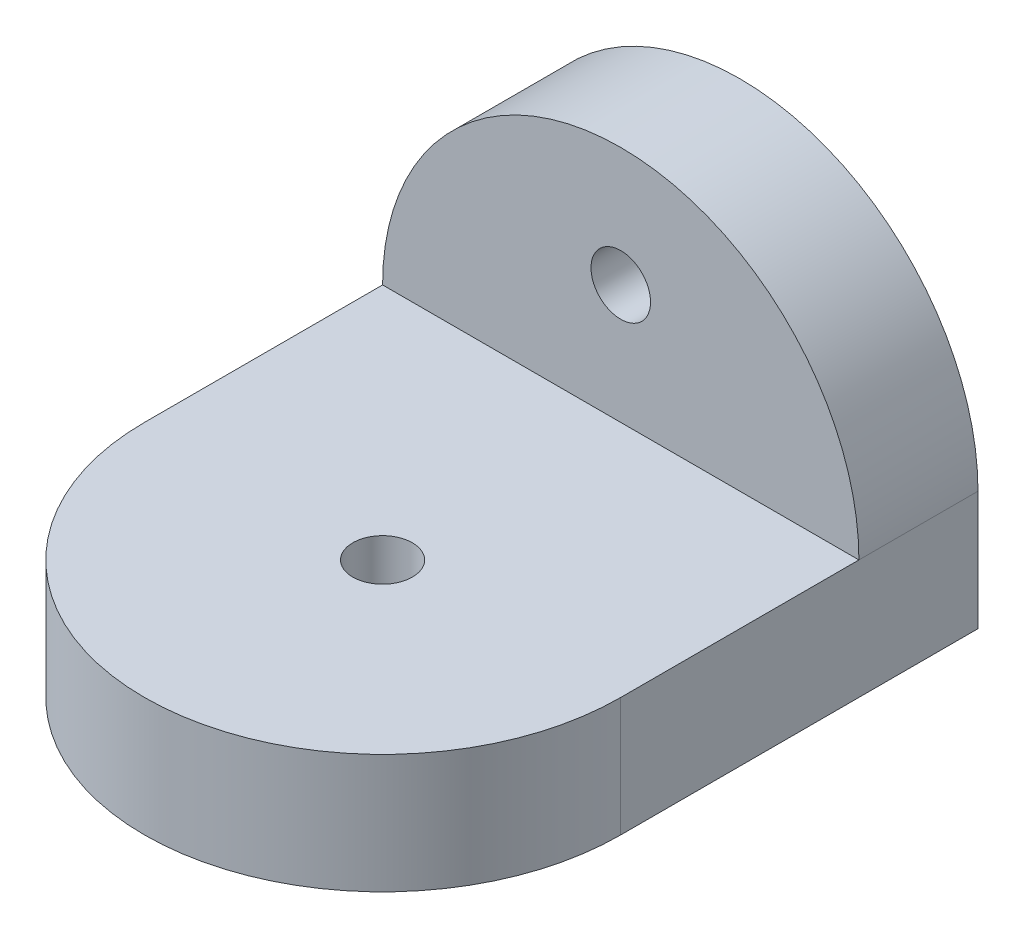
ISO-10303-21;
HEADER;
FILE_DESCRIPTION(('STEP AP214'),'2;1');
FILE_NAME('part.step','',(''),(''),'','','');
FILE_SCHEMA(('AUTOMOTIVE_DESIGN { 1 0 10303 214 1 1 1 1 }'));
ENDSEC;
DATA;
#1=APPLICATION_CONTEXT('core data for automotive mechanical design processes');
#2=APPLICATION_PROTOCOL_DEFINITION('international standard','automotive_design',2000,#1);
#3=PRODUCT_CONTEXT('',#1,'mechanical');
#4=PRODUCT('Part','Part','',(#3));
#5=PRODUCT_RELATED_PRODUCT_CATEGORY('part','',(#4));
#6=PRODUCT_DEFINITION_FORMATION('','',#4);
#7=PRODUCT_DEFINITION_CONTEXT('part definition',#1,'design');
#8=PRODUCT_DEFINITION('design','',#6,#7);
#9=PRODUCT_DEFINITION_SHAPE('','',#8);
#10=(LENGTH_UNIT() NAMED_UNIT(*) SI_UNIT(.MILLI.,.METRE.));
#11=(NAMED_UNIT(*) PLANE_ANGLE_UNIT() SI_UNIT($,.RADIAN.));
#12=(NAMED_UNIT(*) SI_UNIT($,.STERADIAN.) SOLID_ANGLE_UNIT());
#13=UNCERTAINTY_MEASURE_WITH_UNIT(LENGTH_MEASURE(1.E-05),#10,'distance_accuracy_value','');
#14=(GEOMETRIC_REPRESENTATION_CONTEXT(3) GLOBAL_UNCERTAINTY_ASSIGNED_CONTEXT((#13)) GLOBAL_UNIT_ASSIGNED_CONTEXT((#10,
#11,#12)) REPRESENTATION_CONTEXT('',''));
#15=CARTESIAN_POINT('',(0.,0.,0.));
#16=DIRECTION('',(0.,0.,1.));
#17=DIRECTION('',(1.,0.,0.));
#18=AXIS2_PLACEMENT_3D('',#15,#16,#17);
#19=CARTESIAN_POINT('',(10.,0.,5.));
#20=DIRECTION('',(0.,0.,-1.));
#21=DIRECTION('',(-1.,0.,0.));
#22=AXIS2_PLACEMENT_3D('',#19,#20,#21);
#23=CYLINDRICAL_SURFACE('',#22,10.);
#24=CARTESIAN_POINT('',(10.,0.,0.));
#25=DIRECTION('',(0.,0.,1.));
#26=DIRECTION('',(-1.,0.,0.));
#27=AXIS2_PLACEMENT_3D('',#24,#25,#26);
#28=CIRCLE('',#27,10.);
#29=CARTESIAN_POINT('',(20.,0.,0.));
#30=VERTEX_POINT('',#29);
#31=CARTESIAN_POINT('',(0.,0.,0.));
#32=VERTEX_POINT('',#31);
#33=EDGE_CURVE('E103',#30,#32,#28,.T.);
#34=ORIENTED_EDGE('',*,*,#33,.T.);
#35=DIRECTION('',(0.,0.,-1.));
#36=VECTOR('',#35,1.);
#37=CARTESIAN_POINT('',(0.,0.,5.));
#38=LINE('',#37,#36);
#39=CARTESIAN_POINT('',(0.,0.,5.));
#40=VERTEX_POINT('',#39);
#41=EDGE_CURVE('E11',#40,#32,#38,.T.);
#42=ORIENTED_EDGE('',*,*,#41,.F.);
#43=CARTESIAN_POINT('',(10.,0.,5.));
#44=DIRECTION('',(0.,0.,1.));
#45=DIRECTION('',(-1.,0.,0.));
#46=AXIS2_PLACEMENT_3D('',#43,#44,#45);
#47=CIRCLE('',#46,10.);
#48=CARTESIAN_POINT('',(20.,0.,5.));
#49=VERTEX_POINT('',#48);
#50=EDGE_CURVE('E106',#49,#40,#47,.T.);
#51=ORIENTED_EDGE('',*,*,#50,.F.);
#52=DIRECTION('',(0.,0.,-1.));
#53=VECTOR('',#52,1.);
#54=CARTESIAN_POINT('',(20.,0.,5.));
#55=LINE('',#54,#53);
#56=EDGE_CURVE('E44',#49,#30,#55,.T.);
#57=ORIENTED_EDGE('',*,*,#56,.T.);
#58=EDGE_LOOP('',(#34,#42,#51,#57));
#59=FACE_BOUND('',#58,.T.);
#60=ADVANCED_FACE('F36',(#59),#23,.T.);
#61=CARTESIAN_POINT('',(10.,0.,5.));
#62=DIRECTION('',(0.,0.,-1.));
#63=DIRECTION('',(-1.,0.,0.));
#64=AXIS2_PLACEMENT_3D('',#61,#62,#63);
#65=PLANE('',#64);
#66=CARTESIAN_POINT('',(10.,5.,5.));
#67=DIRECTION('',(0.,0.,1.));
#68=DIRECTION('',(1.,0.,0.));
#69=AXIS2_PLACEMENT_3D('',#66,#67,#68);
#70=CIRCLE('',#69,1.25);
#71=CARTESIAN_POINT('',(11.25,5.,5.));
#72=VERTEX_POINT('',#71);
#73=EDGE_CURVE('E133',#72,#72,#70,.T.);
#74=ORIENTED_EDGE('',*,*,#73,.F.);
#75=EDGE_LOOP('',(#74));
#76=FACE_BOUND('',#75,.T.);
#77=ORIENTED_EDGE('',*,*,#50,.T.);
#78=DIRECTION('',(1.,0.,0.));
#79=VECTOR('',#78,1.);
#80=CARTESIAN_POINT('',(0.,0.,5.));
#81=LINE('',#80,#79);
#82=EDGE_CURVE('E50',#40,#49,#81,.T.);
#83=ORIENTED_EDGE('',*,*,#82,.T.);
#84=EDGE_LOOP('',(#77,#83));
#85=FACE_BOUND('',#84,.T.);
#86=ADVANCED_FACE('F159',(#76,#85),#65,.F.);
#87=CARTESIAN_POINT('',(10.,0.,0.));
#88=DIRECTION('',(0.,0.,-1.));
#89=DIRECTION('',(-1.,0.,0.));
#90=AXIS2_PLACEMENT_3D('',#87,#88,#89);
#91=PLANE('',#90);
#92=CARTESIAN_POINT('',(10.,5.,0.));
#93=DIRECTION('',(0.,0.,1.));
#94=DIRECTION('',(1.,0.,0.));
#95=AXIS2_PLACEMENT_3D('',#92,#93,#94);
#96=CIRCLE('',#95,1.25);
#97=CARTESIAN_POINT('',(11.25,5.,0.));
#98=VERTEX_POINT('',#97);
#99=EDGE_CURVE('E130',#98,#98,#96,.T.);
#100=ORIENTED_EDGE('',*,*,#99,.T.);
#101=EDGE_LOOP('',(#100));
#102=FACE_BOUND('',#101,.T.);
#103=ORIENTED_EDGE('',*,*,#33,.F.);
#104=DIRECTION('',(0.,1.,0.));
#105=VECTOR('',#104,1.);
#106=CARTESIAN_POINT('',(20.,-5.,0.));
#107=LINE('',#106,#105);
#108=CARTESIAN_POINT('',(20.,-5.,0.));
#109=VERTEX_POINT('',#108);
#110=EDGE_CURVE('E108',#109,#30,#107,.T.);
#111=ORIENTED_EDGE('',*,*,#110,.F.);
#112=DIRECTION('',(1.,0.,0.));
#113=VECTOR('',#112,1.);
#114=CARTESIAN_POINT('',(0.,-5.,0.));
#115=LINE('',#114,#113);
#116=CARTESIAN_POINT('',(0.,-5.,0.));
#117=VERTEX_POINT('',#116);
#118=EDGE_CURVE('E88',#117,#109,#115,.T.);
#119=ORIENTED_EDGE('',*,*,#118,.F.);
#120=DIRECTION('',(0.,1.,0.));
#121=VECTOR('',#120,1.);
#122=CARTESIAN_POINT('',(0.,-5.,0.));
#123=LINE('',#122,#121);
#124=EDGE_CURVE('E85',#117,#32,#123,.T.);
#125=ORIENTED_EDGE('',*,*,#124,.T.);
#126=EDGE_LOOP('',(#103,#111,#119,#125));
#127=FACE_BOUND('',#126,.T.);
#128=ADVANCED_FACE('F156',(#102,#127),#91,.T.);
#129=CARTESIAN_POINT('',(10.,0.,15.));
#130=DIRECTION('',(0.,1.,0.));
#131=DIRECTION('',(0.,0.,1.));
#132=AXIS2_PLACEMENT_3D('',#129,#130,#131);
#133=PLANE('',#132);
#134=CARTESIAN_POINT('',(10.,0.,15.));
#135=DIRECTION('',(0.,1.,0.));
#136=DIRECTION('',(0.,0.,1.));
#137=AXIS2_PLACEMENT_3D('',#134,#135,#136);
#138=CIRCLE('',#137,1.25);
#139=CARTESIAN_POINT('',(10.,0.,16.25));
#140=VERTEX_POINT('',#139);
#141=EDGE_CURVE('E139',#140,#140,#138,.T.);
#142=ORIENTED_EDGE('',*,*,#141,.F.);
#143=EDGE_LOOP('',(#142));
#144=FACE_BOUND('',#143,.T.);
#145=ORIENTED_EDGE('',*,*,#82,.F.);
#146=DIRECTION('',(0.,0.,-1.));
#147=VECTOR('',#146,1.);
#148=CARTESIAN_POINT('',(0.,0.,15.));
#149=LINE('',#148,#147);
#150=CARTESIAN_POINT('',(0.,0.,15.));
#151=VERTEX_POINT('',#150);
#152=EDGE_CURVE('E127',#151,#40,#149,.T.);
#153=ORIENTED_EDGE('',*,*,#152,.F.);
#154=CARTESIAN_POINT('',(10.,0.,15.));
#155=DIRECTION('',(0.,-1.,0.));
#156=DIRECTION('',(0.,0.,1.));
#157=AXIS2_PLACEMENT_3D('',#154,#155,#156);
#158=CIRCLE('',#157,10.);
#159=CARTESIAN_POINT('',(20.,0.,15.));
#160=VERTEX_POINT('',#159);
#161=EDGE_CURVE('E102',#160,#151,#158,.T.);
#162=ORIENTED_EDGE('',*,*,#161,.F.);
#163=DIRECTION('',(0.,0.,1.));
#164=VECTOR('',#163,1.);
#165=CARTESIAN_POINT('',(20.,0.,0.));
#166=LINE('',#165,#164);
#167=EDGE_CURVE('E98',#49,#160,#166,.T.);
#168=ORIENTED_EDGE('',*,*,#167,.F.);
#169=EDGE_LOOP('',(#145,#153,#162,#168));
#170=FACE_BOUND('',#169,.T.);
#171=ADVANCED_FACE('F153',(#144,#170),#133,.T.);
#172=CARTESIAN_POINT('',(10.,-5.,15.));
#173=DIRECTION('',(0.,1.,0.));
#174=DIRECTION('',(0.,0.,1.));
#175=AXIS2_PLACEMENT_3D('',#172,#173,#174);
#176=CYLINDRICAL_SURFACE('',#175,10.);
#177=ORIENTED_EDGE('',*,*,#161,.T.);
#178=DIRECTION('',(0.,1.,0.));
#179=VECTOR('',#178,1.);
#180=CARTESIAN_POINT('',(0.,-5.,15.));
#181=LINE('',#180,#179);
#182=CARTESIAN_POINT('',(0.,-5.,15.));
#183=VERTEX_POINT('',#182);
#184=EDGE_CURVE('E82',#183,#151,#181,.T.);
#185=ORIENTED_EDGE('',*,*,#184,.F.);
#186=CARTESIAN_POINT('',(10.,-5.,15.));
#187=DIRECTION('',(0.,-1.,0.));
#188=DIRECTION('',(0.,0.,1.));
#189=AXIS2_PLACEMENT_3D('',#186,#187,#188);
#190=CIRCLE('',#189,10.);
#191=CARTESIAN_POINT('',(20.,-5.,15.));
#192=VERTEX_POINT('',#191);
#193=EDGE_CURVE('E89',#192,#183,#190,.T.);
#194=ORIENTED_EDGE('',*,*,#193,.F.);
#195=DIRECTION('',(0.,1.,0.));
#196=VECTOR('',#195,1.);
#197=CARTESIAN_POINT('',(20.,-5.,15.));
#198=LINE('',#197,#196);
#199=EDGE_CURVE('E123',#192,#160,#198,.T.);
#200=ORIENTED_EDGE('',*,*,#199,.T.);
#201=EDGE_LOOP('',(#177,#185,#194,#200));
#202=FACE_BOUND('',#201,.T.);
#203=ADVANCED_FACE('F100',(#202),#176,.T.);
#204=CARTESIAN_POINT('',(0.,-5.,15.));
#205=DIRECTION('',(1.,0.,0.));
#206=DIRECTION('',(0.,0.,-1.));
#207=AXIS2_PLACEMENT_3D('',#204,#205,#206);
#208=PLANE('',#207);
#209=ORIENTED_EDGE('',*,*,#152,.T.);
#210=ORIENTED_EDGE('',*,*,#41,.T.);
#211=ORIENTED_EDGE('',*,*,#124,.F.);
#212=DIRECTION('',(0.,0.,-1.));
#213=VECTOR('',#212,1.);
#214=CARTESIAN_POINT('',(0.,-5.,15.));
#215=LINE('',#214,#213);
#216=EDGE_CURVE('E77',#183,#117,#215,.T.);
#217=ORIENTED_EDGE('',*,*,#216,.F.);
#218=ORIENTED_EDGE('',*,*,#184,.T.);
#219=EDGE_LOOP('',(#209,#210,#211,#217,#218));
#220=FACE_BOUND('',#219,.T.);
#221=ADVANCED_FACE('F80',(#220),#208,.F.);
#222=CARTESIAN_POINT('',(20.,-5.,0.));
#223=DIRECTION('',(-1.,0.,0.));
#224=DIRECTION('',(0.,0.,1.));
#225=AXIS2_PLACEMENT_3D('',#222,#223,#224);
#226=PLANE('',#225);
#227=ORIENTED_EDGE('',*,*,#56,.F.);
#228=ORIENTED_EDGE('',*,*,#167,.T.);
#229=ORIENTED_EDGE('',*,*,#199,.F.);
#230=DIRECTION('',(0.,0.,1.));
#231=VECTOR('',#230,1.);
#232=CARTESIAN_POINT('',(20.,-5.,0.));
#233=LINE('',#232,#231);
#234=EDGE_CURVE('E94',#109,#192,#233,.T.);
#235=ORIENTED_EDGE('',*,*,#234,.F.);
#236=ORIENTED_EDGE('',*,*,#110,.T.);
#237=EDGE_LOOP('',(#227,#228,#229,#235,#236));
#238=FACE_BOUND('',#237,.T.);
#239=ADVANCED_FACE('F121',(#238),#226,.F.);
#240=CARTESIAN_POINT('',(10.,-5.,15.));
#241=DIRECTION('',(0.,1.,0.));
#242=DIRECTION('',(0.,0.,1.));
#243=AXIS2_PLACEMENT_3D('',#240,#241,#242);
#244=PLANE('',#243);
#245=CARTESIAN_POINT('',(10.,-5.,15.));
#246=DIRECTION('',(0.,1.,0.));
#247=DIRECTION('',(0.,0.,1.));
#248=AXIS2_PLACEMENT_3D('',#245,#246,#247);
#249=CIRCLE('',#248,1.25);
#250=CARTESIAN_POINT('',(10.,-5.,16.25));
#251=VERTEX_POINT('',#250);
#252=EDGE_CURVE('E136',#251,#251,#249,.T.);
#253=ORIENTED_EDGE('',*,*,#252,.T.);
#254=EDGE_LOOP('',(#253));
#255=FACE_BOUND('',#254,.T.);
#256=ORIENTED_EDGE('',*,*,#193,.T.);
#257=ORIENTED_EDGE('',*,*,#216,.T.);
#258=ORIENTED_EDGE('',*,*,#118,.T.);
#259=ORIENTED_EDGE('',*,*,#234,.T.);
#260=EDGE_LOOP('',(#256,#257,#258,#259));
#261=FACE_BOUND('',#260,.T.);
#262=ADVANCED_FACE('F92',(#255,#261),#244,.F.);
#263=CARTESIAN_POINT('',(10.,5.,0.));
#264=DIRECTION('',(0.,0.,1.));
#265=DIRECTION('',(1.,0.,0.));
#266=AXIS2_PLACEMENT_3D('',#263,#264,#265);
#267=CYLINDRICAL_SURFACE('',#266,1.25);
#268=ORIENTED_EDGE('',*,*,#99,.F.);
#269=EDGE_LOOP('',(#268));
#270=FACE_BOUND('',#269,.T.);
#271=ORIENTED_EDGE('',*,*,#73,.T.);
#272=EDGE_LOOP('',(#271));
#273=FACE_BOUND('',#272,.T.);
#274=ADVANCED_FACE('F149',(#270,#273),#267,.F.);
#275=CARTESIAN_POINT('',(10.,-5.,15.));
#276=DIRECTION('',(0.,1.,0.));
#277=DIRECTION('',(0.,0.,1.));
#278=AXIS2_PLACEMENT_3D('',#275,#276,#277);
#279=CYLINDRICAL_SURFACE('',#278,1.25);
#280=ORIENTED_EDGE('',*,*,#252,.F.);
#281=EDGE_LOOP('',(#280));
#282=FACE_BOUND('',#281,.T.);
#283=ORIENTED_EDGE('',*,*,#141,.T.);
#284=EDGE_LOOP('',(#283));
#285=FACE_BOUND('',#284,.T.);
#286=ADVANCED_FACE('F146',(#282,#285),#279,.F.);
#287=CLOSED_SHELL('',(#60,#86,#128,#171,#203,#221,#239,#262,#274,#286));
#288=MANIFOLD_SOLID_BREP('B2',#287);
#289=ADVANCED_BREP_SHAPE_REPRESENTATION('',(#18,#288),#14);
#290=SHAPE_DEFINITION_REPRESENTATION(#9,#289);
ENDSEC;
END-ISO-10303-21;
